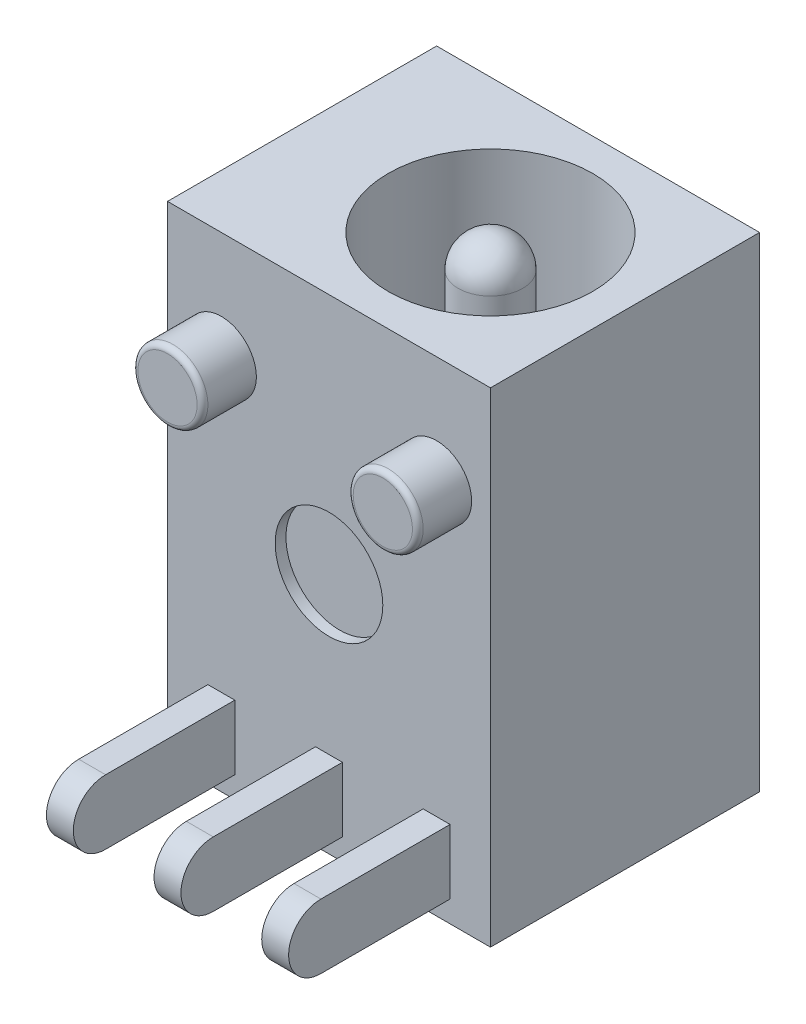
ISO-10303-21;
HEADER;
FILE_DESCRIPTION(('STEP AP214'),'2;1');
FILE_NAME('part.step','',(''),(''),'','','');
FILE_SCHEMA(('AUTOMOTIVE_DESIGN { 1 0 10303 214 1 1 1 1 }'));
ENDSEC;
DATA;
#1=APPLICATION_CONTEXT('core data for automotive mechanical design processes');
#2=APPLICATION_PROTOCOL_DEFINITION('international standard','automotive_design',2000,#1);
#3=PRODUCT_CONTEXT('',#1,'mechanical');
#4=PRODUCT('Part','Part','',(#3));
#5=PRODUCT_RELATED_PRODUCT_CATEGORY('part','',(#4));
#6=PRODUCT_DEFINITION_FORMATION('','',#4);
#7=PRODUCT_DEFINITION_CONTEXT('part definition',#1,'design');
#8=PRODUCT_DEFINITION('design','',#6,#7);
#9=PRODUCT_DEFINITION_SHAPE('','',#8);
#10=(LENGTH_UNIT() NAMED_UNIT(*) SI_UNIT(.MILLI.,.METRE.));
#11=(NAMED_UNIT(*) PLANE_ANGLE_UNIT() SI_UNIT($,.RADIAN.));
#12=(NAMED_UNIT(*) SI_UNIT($,.STERADIAN.) SOLID_ANGLE_UNIT());
#13=UNCERTAINTY_MEASURE_WITH_UNIT(LENGTH_MEASURE(1.E-05),#10,'distance_accuracy_value','');
#14=(GEOMETRIC_REPRESENTATION_CONTEXT(3) GLOBAL_UNCERTAINTY_ASSIGNED_CONTEXT((#13)) GLOBAL_UNIT_ASSIGNED_CONTEXT((#10,
#11,#12)) REPRESENTATION_CONTEXT('',''));
#15=CARTESIAN_POINT('',(0.,0.,0.));
#16=DIRECTION('',(0.,0.,1.));
#17=DIRECTION('',(1.,0.,0.));
#18=AXIS2_PLACEMENT_3D('',#15,#16,#17);
#19=CARTESIAN_POINT('',(0.5,8.4,0.));
#20=DIRECTION('',(0.,0.,-1.));
#21=DIRECTION('',(0.,1.,0.));
#22=AXIS2_PLACEMENT_3D('',#19,#20,#21);
#23=SPHERICAL_SURFACE('',#22,0.6);
#24=CARTESIAN_POINT('',(0.5,8.4,0.));
#25=DIRECTION('',(0.,1.,0.));
#26=DIRECTION('',(0.,0.,1.));
#27=AXIS2_PLACEMENT_3D('',#24,#25,#26);
#28=CIRCLE('',#27,0.6);
#29=CARTESIAN_POINT('',(0.5,8.4,0.6));
#30=VERTEX_POINT('',#29);
#31=CARTESIAN_POINT('',(0.5,8.4,-0.6));
#32=VERTEX_POINT('',#31);
#33=EDGE_CURVE('E272',#30,#32,#28,.F.);
#34=ORIENTED_EDGE('',*,*,#33,.F.);
#35=CARTESIAN_POINT('',(0.5,8.4,0.));
#36=DIRECTION('',(0.,1.,0.));
#37=DIRECTION('',(0.,0.,1.));
#38=AXIS2_PLACEMENT_3D('',#35,#36,#37);
#39=CIRCLE('',#38,0.6);
#40=EDGE_CURVE('E356',#32,#30,#39,.F.);
#41=ORIENTED_EDGE('',*,*,#40,.F.);
#42=EDGE_LOOP('',(#34,#41));
#43=FACE_BOUND('',#42,.T.);
#44=ADVANCED_FACE('F25',(#43),#23,.T.);
#45=CARTESIAN_POINT('',(-2.,7.,3.5));
#46=DIRECTION('',(0.,0.,1.));
#47=DIRECTION('',(1.,0.,0.));
#48=AXIS2_PLACEMENT_3D('',#45,#46,#47);
#49=PLANE('',#48);
#50=CARTESIAN_POINT('',(-2.,7.,3.5));
#51=DIRECTION('',(0.,0.,-1.));
#52=DIRECTION('',(-1.,0.,0.));
#53=AXIS2_PLACEMENT_3D('',#50,#51,#52);
#54=CIRCLE('',#53,0.55);
#55=CARTESIAN_POINT('',(-2.55,7.,3.5));
#56=VERTEX_POINT('',#55);
#57=CARTESIAN_POINT('',(-1.45,7.,3.5));
#58=VERTEX_POINT('',#57);
#59=EDGE_CURVE('E266',#56,#58,#54,.T.);
#60=ORIENTED_EDGE('',*,*,#59,.F.);
#61=CARTESIAN_POINT('',(-2.,7.,3.5));
#62=DIRECTION('',(0.,0.,-1.));
#63=DIRECTION('',(1.,0.,0.));
#64=AXIS2_PLACEMENT_3D('',#61,#62,#63);
#65=CIRCLE('',#64,0.55);
#66=EDGE_CURVE('E268',#58,#56,#65,.T.);
#67=ORIENTED_EDGE('',*,*,#66,.F.);
#68=EDGE_LOOP('',(#60,#67));
#69=FACE_BOUND('',#68,.T.);
#70=ADVANCED_FACE('F274',(#69),#49,.T.);
#71=CARTESIAN_POINT('',(2.,7.,3.5));
#72=DIRECTION('',(0.,0.,1.));
#73=DIRECTION('',(1.,0.,0.));
#74=AXIS2_PLACEMENT_3D('',#71,#72,#73);
#75=PLANE('',#74);
#76=CARTESIAN_POINT('',(2.,7.,3.5));
#77=DIRECTION('',(0.,0.,-1.));
#78=DIRECTION('',(-1.,0.,0.));
#79=AXIS2_PLACEMENT_3D('',#76,#77,#78);
#80=CIRCLE('',#79,0.55);
#81=CARTESIAN_POINT('',(1.45,7.,3.5));
#82=VERTEX_POINT('',#81);
#83=CARTESIAN_POINT('',(2.55,7.,3.5));
#84=VERTEX_POINT('',#83);
#85=EDGE_CURVE('E276',#82,#84,#80,.T.);
#86=ORIENTED_EDGE('',*,*,#85,.F.);
#87=CARTESIAN_POINT('',(2.,7.,3.5));
#88=DIRECTION('',(0.,0.,-1.));
#89=DIRECTION('',(1.,0.,0.));
#90=AXIS2_PLACEMENT_3D('',#87,#88,#89);
#91=CIRCLE('',#90,0.55);
#92=EDGE_CURVE('E228',#84,#82,#91,.T.);
#93=ORIENTED_EDGE('',*,*,#92,.F.);
#94=EDGE_LOOP('',(#86,#93));
#95=FACE_BOUND('',#94,.T.);
#96=ADVANCED_FACE('F292',(#95),#75,.T.);
#97=CARTESIAN_POINT('',(0.25,0.4,5.5));
#98=DIRECTION('',(-1.,0.,0.));
#99=DIRECTION('',(0.,0.,1.));
#100=AXIS2_PLACEMENT_3D('',#97,#98,#99);
#101=PLANE('',#100);
#102=CARTESIAN_POINT('',(0.25,1.,4.9));
#103=DIRECTION('',(1.,0.,0.));
#104=DIRECTION('',(0.,0.,-1.));
#105=AXIS2_PLACEMENT_3D('',#102,#103,#104);
#106=CIRCLE('',#105,0.6);
#107=CARTESIAN_POINT('',(0.25,0.4,4.9));
#108=VERTEX_POINT('',#107);
#109=CARTESIAN_POINT('',(0.25,1.6,4.9));
#110=VERTEX_POINT('',#109);
#111=EDGE_CURVE('E180',#108,#110,#106,.F.);
#112=ORIENTED_EDGE('',*,*,#111,.F.);
#113=DIRECTION('',(0.,0.,1.));
#114=VECTOR('',#113,1.);
#115=CARTESIAN_POINT('',(0.25,0.4,5.5));
#116=LINE('',#115,#114);
#117=CARTESIAN_POINT('',(0.25,0.4,2.5));
#118=VERTEX_POINT('',#117);
#119=EDGE_CURVE('E186',#108,#118,#116,.F.);
#120=ORIENTED_EDGE('',*,*,#119,.T.);
#121=DIRECTION('',(0.,1.,0.));
#122=VECTOR('',#121,1.);
#123=CARTESIAN_POINT('',(0.25,0.4,2.5));
#124=LINE('',#123,#122);
#125=CARTESIAN_POINT('',(0.25,1.6,2.5));
#126=VERTEX_POINT('',#125);
#127=EDGE_CURVE('E191',#126,#118,#124,.F.);
#128=ORIENTED_EDGE('',*,*,#127,.F.);
#129=DIRECTION('',(0.,0.,-1.));
#130=VECTOR('',#129,1.);
#131=CARTESIAN_POINT('',(0.25,1.6,5.5));
#132=LINE('',#131,#130);
#133=EDGE_CURVE('E188',#126,#110,#132,.F.);
#134=ORIENTED_EDGE('',*,*,#133,.T.);
#135=EDGE_LOOP('',(#112,#120,#128,#134));
#136=FACE_BOUND('',#135,.T.);
#137=ADVANCED_FACE('F185',(#136),#101,.F.);
#138=CARTESIAN_POINT('',(2.25,1.6,5.5));
#139=DIRECTION('',(-1.,0.,0.));
#140=DIRECTION('',(0.,-1.,0.));
#141=AXIS2_PLACEMENT_3D('',#138,#139,#140);
#142=PLANE('',#141);
#143=CARTESIAN_POINT('',(2.25,1.,4.9));
#144=DIRECTION('',(1.,0.,0.));
#145=DIRECTION('',(0.,0.,-1.));
#146=AXIS2_PLACEMENT_3D('',#143,#144,#145);
#147=CIRCLE('',#146,0.6);
#148=CARTESIAN_POINT('',(2.25,0.4,4.9));
#149=VERTEX_POINT('',#148);
#150=CARTESIAN_POINT('',(2.25,1.6,4.9));
#151=VERTEX_POINT('',#150);
#152=EDGE_CURVE('E459',#149,#151,#147,.F.);
#153=ORIENTED_EDGE('',*,*,#152,.F.);
#154=DIRECTION('',(0.,0.,1.));
#155=VECTOR('',#154,1.);
#156=CARTESIAN_POINT('',(2.25,0.4,5.5));
#157=LINE('',#156,#155);
#158=CARTESIAN_POINT('',(2.25,0.4,2.5));
#159=VERTEX_POINT('',#158);
#160=EDGE_CURVE('E366',#149,#159,#157,.F.);
#161=ORIENTED_EDGE('',*,*,#160,.T.);
#162=DIRECTION('',(0.,-1.,0.));
#163=VECTOR('',#162,1.);
#164=CARTESIAN_POINT('',(2.25,1.6,2.5));
#165=LINE('',#164,#163);
#166=CARTESIAN_POINT('',(2.25,1.6,2.5));
#167=VERTEX_POINT('',#166);
#168=EDGE_CURVE('E190',#167,#159,#165,.T.);
#169=ORIENTED_EDGE('',*,*,#168,.F.);
#170=DIRECTION('',(0.,0.,-1.));
#171=VECTOR('',#170,1.);
#172=CARTESIAN_POINT('',(2.25,1.6,5.5));
#173=LINE('',#172,#171);
#174=EDGE_CURVE('E210',#167,#151,#173,.F.);
#175=ORIENTED_EDGE('',*,*,#174,.T.);
#176=EDGE_LOOP('',(#153,#161,#169,#175));
#177=FACE_BOUND('',#176,.T.);
#178=ADVANCED_FACE('F669',(#177),#142,.F.);
#179=CARTESIAN_POINT('',(-1.75,0.4,5.5));
#180=DIRECTION('',(-1.,0.,0.));
#181=DIRECTION('',(0.,0.,1.));
#182=AXIS2_PLACEMENT_3D('',#179,#180,#181);
#183=PLANE('',#182);
#184=CARTESIAN_POINT('',(-1.75,1.,4.9));
#185=DIRECTION('',(-1.,0.,0.));
#186=DIRECTION('',(0.,0.,1.));
#187=AXIS2_PLACEMENT_3D('',#184,#185,#186);
#188=CIRCLE('',#187,0.6);
#189=CARTESIAN_POINT('',(-1.75,0.4,4.9));
#190=VERTEX_POINT('',#189);
#191=CARTESIAN_POINT('',(-1.75,1.6,4.9));
#192=VERTEX_POINT('',#191);
#193=EDGE_CURVE('E341',#190,#192,#188,.T.);
#194=ORIENTED_EDGE('',*,*,#193,.F.);
#195=DIRECTION('',(0.,0.,1.));
#196=VECTOR('',#195,1.);
#197=CARTESIAN_POINT('',(-1.75,0.4,5.5));
#198=LINE('',#197,#196);
#199=CARTESIAN_POINT('',(-1.75,0.4,2.5));
#200=VERTEX_POINT('',#199);
#201=EDGE_CURVE('E323',#190,#200,#198,.F.);
#202=ORIENTED_EDGE('',*,*,#201,.T.);
#203=DIRECTION('',(0.,1.,0.));
#204=VECTOR('',#203,1.);
#205=CARTESIAN_POINT('',(-1.75,0.4,2.5));
#206=LINE('',#205,#204);
#207=CARTESIAN_POINT('',(-1.75,1.6,2.5));
#208=VERTEX_POINT('',#207);
#209=EDGE_CURVE('E353',#208,#200,#206,.F.);
#210=ORIENTED_EDGE('',*,*,#209,.F.);
#211=DIRECTION('',(0.,0.,-1.));
#212=VECTOR('',#211,1.);
#213=CARTESIAN_POINT('',(-1.75,1.6,5.5));
#214=LINE('',#213,#212);
#215=EDGE_CURVE('E358',#208,#192,#214,.F.);
#216=ORIENTED_EDGE('',*,*,#215,.T.);
#217=EDGE_LOOP('',(#194,#202,#210,#216));
#218=FACE_BOUND('',#217,.T.);
#219=ADVANCED_FACE('F515',(#218),#183,.F.);
#220=CARTESIAN_POINT('',(0.5,2.,0.));
#221=DIRECTION('',(0.,1.,0.));
#222=DIRECTION('',(0.,0.,1.));
#223=AXIS2_PLACEMENT_3D('',#220,#221,#222);
#224=CYLINDRICAL_SURFACE('',#223,0.6);
#225=CARTESIAN_POINT('',(0.5,2.,0.));
#226=DIRECTION('',(0.,1.,0.));
#227=DIRECTION('',(0.,0.,1.));
#228=AXIS2_PLACEMENT_3D('',#225,#226,#227);
#229=CIRCLE('',#228,0.6);
#230=CARTESIAN_POINT('',(0.5,2.,0.6));
#231=VERTEX_POINT('',#230);
#232=EDGE_CURVE('E326',#231,#231,#229,.F.);
#233=ORIENTED_EDGE('',*,*,#232,.F.);
#234=EDGE_LOOP('',(#233));
#235=FACE_BOUND('',#234,.T.);
#236=ORIENTED_EDGE('',*,*,#40,.T.);
#237=ORIENTED_EDGE('',*,*,#33,.T.);
#238=EDGE_LOOP('',(#236,#237));
#239=FACE_BOUND('',#238,.T.);
#240=ADVANCED_FACE('F554',(#235,#239),#224,.T.);
#241=CARTESIAN_POINT('',(0.,4.5,2.3));
#242=DIRECTION('',(0.,0.,1.));
#243=DIRECTION('',(1.,0.,0.));
#244=AXIS2_PLACEMENT_3D('',#241,#242,#243);
#245=PLANE('',#244);
#246=CARTESIAN_POINT('',(0.,4.5,2.3));
#247=DIRECTION('',(0.,0.,1.));
#248=DIRECTION('',(1.,0.,0.));
#249=AXIS2_PLACEMENT_3D('',#246,#247,#248);
#250=CIRCLE('',#249,1.);
#251=CARTESIAN_POINT('',(1.,4.5,2.3));
#252=VERTEX_POINT('',#251);
#253=EDGE_CURVE('E337',#252,#252,#250,.T.);
#254=ORIENTED_EDGE('',*,*,#253,.T.);
#255=EDGE_LOOP('',(#254));
#256=FACE_BOUND('',#255,.T.);
#257=ADVANCED_FACE('F649',(#256),#245,.T.);
#258=CARTESIAN_POINT('',(-2.,7.,3.4));
#259=DIRECTION('',(0.,0.,1.));
#260=DIRECTION('',(1.,0.,0.));
#261=AXIS2_PLACEMENT_3D('',#258,#259,#260);
#262=TOROIDAL_SURFACE('',#261,0.55,0.1);
#263=CARTESIAN_POINT('',(-2.,7.,3.4));
#264=DIRECTION('',(0.,0.,-1.));
#265=DIRECTION('',(-1.,0.,0.));
#266=AXIS2_PLACEMENT_3D('',#263,#264,#265);
#267=CIRCLE('',#266,0.65);
#268=CARTESIAN_POINT('',(-2.65,7.,3.4));
#269=VERTEX_POINT('',#268);
#270=EDGE_CURVE('E235',#269,#269,#267,.T.);
#271=ORIENTED_EDGE('',*,*,#270,.F.);
#272=EDGE_LOOP('',(#271));
#273=FACE_BOUND('',#272,.T.);
#274=ORIENTED_EDGE('',*,*,#66,.T.);
#275=ORIENTED_EDGE('',*,*,#59,.T.);
#276=EDGE_LOOP('',(#274,#275));
#277=FACE_BOUND('',#276,.T.);
#278=ADVANCED_FACE('F244',(#273,#277),#262,.T.);
#279=CARTESIAN_POINT('',(2.,7.,3.4));
#280=DIRECTION('',(0.,0.,1.));
#281=DIRECTION('',(1.,0.,0.));
#282=AXIS2_PLACEMENT_3D('',#279,#280,#281);
#283=TOROIDAL_SURFACE('',#282,0.55,0.1);
#284=CARTESIAN_POINT('',(2.,7.,3.4));
#285=DIRECTION('',(0.,0.,-1.));
#286=DIRECTION('',(-1.,0.,0.));
#287=AXIS2_PLACEMENT_3D('',#284,#285,#286);
#288=CIRCLE('',#287,0.65);
#289=CARTESIAN_POINT('',(1.35,7.,3.4));
#290=VERTEX_POINT('',#289);
#291=EDGE_CURVE('E231',#290,#290,#288,.T.);
#292=ORIENTED_EDGE('',*,*,#291,.F.);
#293=EDGE_LOOP('',(#292));
#294=FACE_BOUND('',#293,.T.);
#295=ORIENTED_EDGE('',*,*,#92,.T.);
#296=ORIENTED_EDGE('',*,*,#85,.T.);
#297=EDGE_LOOP('',(#295,#296));
#298=FACE_BOUND('',#297,.T.);
#299=ADVANCED_FACE('F240',(#294,#298),#283,.T.);
#300=CARTESIAN_POINT('',(0.25,0.4,5.5));
#301=DIRECTION('',(0.,1.,0.));
#302=DIRECTION('',(0.,0.,1.));
#303=AXIS2_PLACEMENT_3D('',#300,#301,#302);
#304=PLANE('',#303);
#305=DIRECTION('',(-1.,0.,0.));
#306=VECTOR('',#305,1.);
#307=CARTESIAN_POINT('',(0.,0.4,4.9));
#308=LINE('',#307,#306);
#309=CARTESIAN_POINT('',(-0.25,0.4,4.9));
#310=VERTEX_POINT('',#309);
#311=EDGE_CURVE('E197',#310,#108,#308,.F.);
#312=ORIENTED_EDGE('',*,*,#311,.F.);
#313=DIRECTION('',(0.,0.,-1.));
#314=VECTOR('',#313,1.);
#315=CARTESIAN_POINT('',(-0.25,0.4,5.5));
#316=LINE('',#315,#314);
#317=CARTESIAN_POINT('',(-0.25,0.4,2.5));
#318=VERTEX_POINT('',#317);
#319=EDGE_CURVE('E234',#310,#318,#316,.T.);
#320=ORIENTED_EDGE('',*,*,#319,.T.);
#321=DIRECTION('',(1.,0.,0.));
#322=VECTOR('',#321,1.);
#323=CARTESIAN_POINT('',(0.25,0.4,2.5));
#324=LINE('',#323,#322);
#325=EDGE_CURVE('E199',#118,#318,#324,.F.);
#326=ORIENTED_EDGE('',*,*,#325,.F.);
#327=ORIENTED_EDGE('',*,*,#119,.F.);
#328=EDGE_LOOP('',(#312,#320,#326,#327));
#329=FACE_BOUND('',#328,.T.);
#330=ADVANCED_FACE('F195',(#329),#304,.F.);
#331=CARTESIAN_POINT('',(0.25,1.6,5.5));
#332=DIRECTION('',(0.,-1.,0.));
#333=DIRECTION('',(0.,0.,-1.));
#334=AXIS2_PLACEMENT_3D('',#331,#332,#333);
#335=PLANE('',#334);
#336=DIRECTION('',(1.,0.,0.));
#337=VECTOR('',#336,1.);
#338=CARTESIAN_POINT('',(0.,1.6,4.9));
#339=LINE('',#338,#337);
#340=CARTESIAN_POINT('',(-0.25,1.6,4.9));
#341=VERTEX_POINT('',#340);
#342=EDGE_CURVE('E206',#110,#341,#339,.F.);
#343=ORIENTED_EDGE('',*,*,#342,.F.);
#344=ORIENTED_EDGE('',*,*,#133,.F.);
#345=DIRECTION('',(1.,0.,0.));
#346=VECTOR('',#345,1.);
#347=CARTESIAN_POINT('',(0.25,1.6,2.5));
#348=LINE('',#347,#346);
#349=CARTESIAN_POINT('',(-0.25,1.6,2.5));
#350=VERTEX_POINT('',#349);
#351=EDGE_CURVE('E201',#350,#126,#348,.T.);
#352=ORIENTED_EDGE('',*,*,#351,.F.);
#353=DIRECTION('',(0.,0.,-1.));
#354=VECTOR('',#353,1.);
#355=CARTESIAN_POINT('',(-0.25,1.6,5.5));
#356=LINE('',#355,#354);
#357=EDGE_CURVE('E433',#350,#341,#356,.F.);
#358=ORIENTED_EDGE('',*,*,#357,.T.);
#359=EDGE_LOOP('',(#343,#344,#352,#358));
#360=FACE_BOUND('',#359,.T.);
#361=ADVANCED_FACE('F497',(#360),#335,.F.);
#362=CARTESIAN_POINT('',(0.,1.,4.9));
#363=DIRECTION('',(-1.,0.,0.));
#364=DIRECTION('',(0.,0.,1.));
#365=AXIS2_PLACEMENT_3D('',#362,#363,#364);
#366=CYLINDRICAL_SURFACE('',#365,0.6);
#367=ORIENTED_EDGE('',*,*,#311,.T.);
#368=ORIENTED_EDGE('',*,*,#111,.T.);
#369=ORIENTED_EDGE('',*,*,#342,.T.);
#370=CARTESIAN_POINT('',(-0.25,1.,4.9));
#371=DIRECTION('',(-1.,0.,0.));
#372=DIRECTION('',(0.,0.,1.));
#373=AXIS2_PLACEMENT_3D('',#370,#371,#372);
#374=CIRCLE('',#373,0.6);
#375=EDGE_CURVE('E204',#341,#310,#374,.F.);
#376=ORIENTED_EDGE('',*,*,#375,.T.);
#377=EDGE_LOOP('',(#367,#368,#369,#376));
#378=FACE_BOUND('',#377,.T.);
#379=ADVANCED_FACE('F203',(#378),#366,.T.);
#380=CARTESIAN_POINT('',(2.25,1.6,5.5));
#381=DIRECTION('',(0.,-1.,0.));
#382=DIRECTION('',(0.,0.,-1.));
#383=AXIS2_PLACEMENT_3D('',#380,#381,#382);
#384=PLANE('',#383);
#385=DIRECTION('',(-1.,0.,0.));
#386=VECTOR('',#385,1.);
#387=CARTESIAN_POINT('',(0.,1.6,4.9));
#388=LINE('',#387,#386);
#389=CARTESIAN_POINT('',(1.75,1.6,4.9));
#390=VERTEX_POINT('',#389);
#391=EDGE_CURVE('E467',#151,#390,#388,.T.);
#392=ORIENTED_EDGE('',*,*,#391,.F.);
#393=ORIENTED_EDGE('',*,*,#174,.F.);
#394=DIRECTION('',(1.,0.,0.));
#395=VECTOR('',#394,1.);
#396=CARTESIAN_POINT('',(2.25,1.6,2.5));
#397=LINE('',#396,#395);
#398=CARTESIAN_POINT('',(1.75,1.6,2.5));
#399=VERTEX_POINT('',#398);
#400=EDGE_CURVE('E205',#399,#167,#397,.T.);
#401=ORIENTED_EDGE('',*,*,#400,.F.);
#402=DIRECTION('',(0.,0.,-1.));
#403=VECTOR('',#402,1.);
#404=CARTESIAN_POINT('',(1.75,1.6,5.5));
#405=LINE('',#404,#403);
#406=EDGE_CURVE('E427',#399,#390,#405,.F.);
#407=ORIENTED_EDGE('',*,*,#406,.T.);
#408=EDGE_LOOP('',(#392,#393,#401,#407));
#409=FACE_BOUND('',#408,.T.);
#410=ADVANCED_FACE('F626',(#409),#384,.F.);
#411=CARTESIAN_POINT('',(0.,1.,4.9));
#412=DIRECTION('',(1.,0.,0.));
#413=DIRECTION('',(0.,0.,-1.));
#414=AXIS2_PLACEMENT_3D('',#411,#412,#413);
#415=CYLINDRICAL_SURFACE('',#414,0.6);
#416=ORIENTED_EDGE('',*,*,#152,.T.);
#417=ORIENTED_EDGE('',*,*,#391,.T.);
#418=CARTESIAN_POINT('',(1.75,1.,4.9));
#419=DIRECTION('',(1.,0.,0.));
#420=DIRECTION('',(0.,0.,-1.));
#421=AXIS2_PLACEMENT_3D('',#418,#419,#420);
#422=CIRCLE('',#421,0.6);
#423=CARTESIAN_POINT('',(1.75,0.4,4.9));
#424=VERTEX_POINT('',#423);
#425=EDGE_CURVE('E424',#390,#424,#422,.T.);
#426=ORIENTED_EDGE('',*,*,#425,.T.);
#427=DIRECTION('',(1.,0.,0.));
#428=VECTOR('',#427,1.);
#429=CARTESIAN_POINT('',(2.25,0.4,4.9));
#430=LINE('',#429,#428);
#431=EDGE_CURVE('E452',#424,#149,#430,.T.);
#432=ORIENTED_EDGE('',*,*,#431,.T.);
#433=EDGE_LOOP('',(#416,#417,#426,#432));
#434=FACE_BOUND('',#433,.T.);
#435=ADVANCED_FACE('F622',(#434),#415,.T.);
#436=CARTESIAN_POINT('',(2.25,0.4,5.5));
#437=DIRECTION('',(0.,1.,0.));
#438=DIRECTION('',(0.,0.,1.));
#439=AXIS2_PLACEMENT_3D('',#436,#437,#438);
#440=PLANE('',#439);
#441=ORIENTED_EDGE('',*,*,#431,.F.);
#442=DIRECTION('',(0.,0.,-1.));
#443=VECTOR('',#442,1.);
#444=CARTESIAN_POINT('',(1.75,0.4,5.5));
#445=LINE('',#444,#443);
#446=CARTESIAN_POINT('',(1.75,0.4,2.5));
#447=VERTEX_POINT('',#446);
#448=EDGE_CURVE('E376',#424,#447,#445,.T.);
#449=ORIENTED_EDGE('',*,*,#448,.T.);
#450=DIRECTION('',(1.,0.,0.));
#451=VECTOR('',#450,1.);
#452=CARTESIAN_POINT('',(2.25,0.4,2.5));
#453=LINE('',#452,#451);
#454=EDGE_CURVE('E456',#159,#447,#453,.F.);
#455=ORIENTED_EDGE('',*,*,#454,.F.);
#456=ORIENTED_EDGE('',*,*,#160,.F.);
#457=EDGE_LOOP('',(#441,#449,#455,#456));
#458=FACE_BOUND('',#457,.T.);
#459=ADVANCED_FACE('F619',(#458),#440,.F.);
#460=CARTESIAN_POINT('',(-1.75,1.6,5.5));
#461=DIRECTION('',(0.,-1.,0.));
#462=DIRECTION('',(0.,0.,-1.));
#463=AXIS2_PLACEMENT_3D('',#460,#461,#462);
#464=PLANE('',#463);
#465=DIRECTION('',(1.,0.,0.));
#466=VECTOR('',#465,1.);
#467=CARTESIAN_POINT('',(0.,1.6,4.9));
#468=LINE('',#467,#466);
#469=CARTESIAN_POINT('',(-2.25,1.6,4.9));
#470=VERTEX_POINT('',#469);
#471=EDGE_CURVE('E361',#192,#470,#468,.F.);
#472=ORIENTED_EDGE('',*,*,#471,.F.);
#473=ORIENTED_EDGE('',*,*,#215,.F.);
#474=DIRECTION('',(1.,0.,0.));
#475=VECTOR('',#474,1.);
#476=CARTESIAN_POINT('',(-1.75,1.6,2.5));
#477=LINE('',#476,#475);
#478=CARTESIAN_POINT('',(-2.25,1.6,2.5));
#479=VERTEX_POINT('',#478);
#480=EDGE_CURVE('E362',#479,#208,#477,.T.);
#481=ORIENTED_EDGE('',*,*,#480,.F.);
#482=DIRECTION('',(0.,0.,-1.));
#483=VECTOR('',#482,1.);
#484=CARTESIAN_POINT('',(-2.25,1.6,5.5));
#485=LINE('',#484,#483);
#486=EDGE_CURVE('E373',#479,#470,#485,.F.);
#487=ORIENTED_EDGE('',*,*,#486,.T.);
#488=EDGE_LOOP('',(#472,#473,#481,#487));
#489=FACE_BOUND('',#488,.T.);
#490=ADVANCED_FACE('F517',(#489),#464,.F.);
#491=CARTESIAN_POINT('',(0.,1.,4.9));
#492=DIRECTION('',(-1.,0.,0.));
#493=DIRECTION('',(0.,0.,1.));
#494=AXIS2_PLACEMENT_3D('',#491,#492,#493);
#495=CYLINDRICAL_SURFACE('',#494,0.6);
#496=ORIENTED_EDGE('',*,*,#193,.T.);
#497=ORIENTED_EDGE('',*,*,#471,.T.);
#498=CARTESIAN_POINT('',(-2.25,1.,4.9));
#499=DIRECTION('',(-1.,0.,0.));
#500=DIRECTION('',(0.,0.,1.));
#501=AXIS2_PLACEMENT_3D('',#498,#499,#500);
#502=CIRCLE('',#501,0.6);
#503=CARTESIAN_POINT('',(-2.25,0.4,4.9));
#504=VERTEX_POINT('',#503);
#505=EDGE_CURVE('E347',#470,#504,#502,.F.);
#506=ORIENTED_EDGE('',*,*,#505,.T.);
#507=DIRECTION('',(1.,0.,0.));
#508=VECTOR('',#507,1.);
#509=CARTESIAN_POINT('',(-1.75,0.4,4.9));
#510=LINE('',#509,#508);
#511=EDGE_CURVE('E327',#504,#190,#510,.T.);
#512=ORIENTED_EDGE('',*,*,#511,.T.);
#513=EDGE_LOOP('',(#496,#497,#506,#512));
#514=FACE_BOUND('',#513,.T.);
#515=ADVANCED_FACE('F509',(#514),#495,.T.);
#516=CARTESIAN_POINT('',(-1.75,0.4,5.5));
#517=DIRECTION('',(0.,1.,0.));
#518=DIRECTION('',(0.,0.,1.));
#519=AXIS2_PLACEMENT_3D('',#516,#517,#518);
#520=PLANE('',#519);
#521=ORIENTED_EDGE('',*,*,#511,.F.);
#522=DIRECTION('',(0.,0.,-1.));
#523=VECTOR('',#522,1.);
#524=CARTESIAN_POINT('',(-2.25,0.4,5.5));
#525=LINE('',#524,#523);
#526=CARTESIAN_POINT('',(-2.25,0.4,2.5));
#527=VERTEX_POINT('',#526);
#528=EDGE_CURVE('E343',#504,#527,#525,.T.);
#529=ORIENTED_EDGE('',*,*,#528,.T.);
#530=DIRECTION('',(1.,0.,0.));
#531=VECTOR('',#530,1.);
#532=CARTESIAN_POINT('',(-1.75,0.4,2.5));
#533=LINE('',#532,#531);
#534=EDGE_CURVE('E339',#200,#527,#533,.F.);
#535=ORIENTED_EDGE('',*,*,#534,.F.);
#536=ORIENTED_EDGE('',*,*,#201,.F.);
#537=EDGE_LOOP('',(#521,#529,#535,#536));
#538=FACE_BOUND('',#537,.T.);
#539=ADVANCED_FACE('F526',(#538),#520,.F.);
#540=CARTESIAN_POINT('',(0.5,2.,0.));
#541=DIRECTION('',(0.,1.,0.));
#542=DIRECTION('',(0.,0.,1.));
#543=AXIS2_PLACEMENT_3D('',#540,#541,#542);
#544=PLANE('',#543);
#545=CARTESIAN_POINT('',(0.5,2.,0.));
#546=DIRECTION('',(0.,1.,0.));
#547=DIRECTION('',(0.,0.,1.));
#548=AXIS2_PLACEMENT_3D('',#545,#546,#547);
#549=CIRCLE('',#548,1.9);
#550=CARTESIAN_POINT('',(0.5,2.,1.9));
#551=VERTEX_POINT('',#550);
#552=EDGE_CURVE('E346',#551,#551,#549,.T.);
#553=ORIENTED_EDGE('',*,*,#552,.T.);
#554=EDGE_LOOP('',(#553));
#555=FACE_BOUND('',#554,.T.);
#556=ORIENTED_EDGE('',*,*,#232,.T.);
#557=EDGE_LOOP('',(#556));
#558=FACE_BOUND('',#557,.T.);
#559=ADVANCED_FACE('F608',(#555,#558),#544,.T.);
#560=CARTESIAN_POINT('',(0.,4.5,2.3));
#561=DIRECTION('',(0.,0.,1.));
#562=DIRECTION('',(1.,0.,0.));
#563=AXIS2_PLACEMENT_3D('',#560,#561,#562);
#564=CYLINDRICAL_SURFACE('',#563,1.);
#565=ORIENTED_EDGE('',*,*,#253,.F.);
#566=EDGE_LOOP('',(#565));
#567=FACE_BOUND('',#566,.T.);
#568=CARTESIAN_POINT('',(0.,4.5,2.5));
#569=DIRECTION('',(0.,0.,1.));
#570=DIRECTION('',(1.,0.,0.));
#571=AXIS2_PLACEMENT_3D('',#568,#569,#570);
#572=CIRCLE('',#571,1.);
#573=CARTESIAN_POINT('',(1.,4.5,2.5));
#574=VERTEX_POINT('',#573);
#575=EDGE_CURVE('E351',#574,#574,#572,.T.);
#576=ORIENTED_EDGE('',*,*,#575,.T.);
#577=EDGE_LOOP('',(#576));
#578=FACE_BOUND('',#577,.T.);
#579=ADVANCED_FACE('F604',(#567,#578),#564,.F.);
#580=CARTESIAN_POINT('',(-2.,7.,3.5));
#581=DIRECTION('',(0.,0.,-1.));
#582=DIRECTION('',(-1.,0.,0.));
#583=AXIS2_PLACEMENT_3D('',#580,#581,#582);
#584=CYLINDRICAL_SURFACE('',#583,0.65);
#585=ORIENTED_EDGE('',*,*,#270,.T.);
#586=EDGE_LOOP('',(#585));
#587=FACE_BOUND('',#586,.T.);
#588=CARTESIAN_POINT('',(-2.,7.,2.5));
#589=DIRECTION('',(0.,0.,-1.));
#590=DIRECTION('',(-1.,0.,0.));
#591=AXIS2_PLACEMENT_3D('',#588,#589,#590);
#592=CIRCLE('',#591,0.65);
#593=CARTESIAN_POINT('',(-2.65,7.,2.5));
#594=VERTEX_POINT('',#593);
#595=EDGE_CURVE('E378',#594,#594,#592,.F.);
#596=ORIENTED_EDGE('',*,*,#595,.T.);
#597=EDGE_LOOP('',(#596));
#598=FACE_BOUND('',#597,.T.);
#599=ADVANCED_FACE('F600',(#587,#598),#584,.T.);
#600=CARTESIAN_POINT('',(2.,7.,3.5));
#601=DIRECTION('',(0.,0.,-1.));
#602=DIRECTION('',(-1.,0.,0.));
#603=AXIS2_PLACEMENT_3D('',#600,#601,#602);
#604=CYLINDRICAL_SURFACE('',#603,0.65);
#605=ORIENTED_EDGE('',*,*,#291,.T.);
#606=EDGE_LOOP('',(#605));
#607=FACE_BOUND('',#606,.T.);
#608=CARTESIAN_POINT('',(2.,7.,2.5));
#609=DIRECTION('',(0.,0.,-1.));
#610=DIRECTION('',(-1.,0.,0.));
#611=AXIS2_PLACEMENT_3D('',#608,#609,#610);
#612=CIRCLE('',#611,0.65);
#613=CARTESIAN_POINT('',(1.35,7.,2.5));
#614=VERTEX_POINT('',#613);
#615=EDGE_CURVE('E224',#614,#614,#612,.F.);
#616=ORIENTED_EDGE('',*,*,#615,.T.);
#617=EDGE_LOOP('',(#616));
#618=FACE_BOUND('',#617,.T.);
#619=ADVANCED_FACE('F597',(#607,#618),#604,.T.);
#620=CARTESIAN_POINT('',(-0.25,0.4,5.5));
#621=DIRECTION('',(1.,0.,0.));
#622=DIRECTION('',(0.,0.,-1.));
#623=AXIS2_PLACEMENT_3D('',#620,#621,#622);
#624=PLANE('',#623);
#625=ORIENTED_EDGE('',*,*,#375,.F.);
#626=ORIENTED_EDGE('',*,*,#357,.F.);
#627=DIRECTION('',(0.,1.,0.));
#628=VECTOR('',#627,1.);
#629=CARTESIAN_POINT('',(-0.25,9.,2.5));
#630=LINE('',#629,#628);
#631=EDGE_CURVE('E220',#350,#318,#630,.F.);
#632=ORIENTED_EDGE('',*,*,#631,.T.);
#633=ORIENTED_EDGE('',*,*,#319,.F.);
#634=EDGE_LOOP('',(#625,#626,#632,#633));
#635=FACE_BOUND('',#634,.T.);
#636=ADVANCED_FACE('F500',(#635),#624,.F.);
#637=CARTESIAN_POINT('',(1.75,1.6,5.5));
#638=DIRECTION('',(1.,0.,0.));
#639=DIRECTION('',(0.,0.,-1.));
#640=AXIS2_PLACEMENT_3D('',#637,#638,#639);
#641=PLANE('',#640);
#642=ORIENTED_EDGE('',*,*,#425,.F.);
#643=ORIENTED_EDGE('',*,*,#406,.F.);
#644=DIRECTION('',(0.,1.,0.));
#645=VECTOR('',#644,1.);
#646=CARTESIAN_POINT('',(1.75,9.,2.5));
#647=LINE('',#646,#645);
#648=EDGE_CURVE('E223',#399,#447,#647,.F.);
#649=ORIENTED_EDGE('',*,*,#648,.T.);
#650=ORIENTED_EDGE('',*,*,#448,.F.);
#651=EDGE_LOOP('',(#642,#643,#649,#650));
#652=FACE_BOUND('',#651,.T.);
#653=ADVANCED_FACE('F591',(#652),#641,.F.);
#654=CARTESIAN_POINT('',(-2.25,0.4,5.5));
#655=DIRECTION('',(1.,0.,0.));
#656=DIRECTION('',(0.,0.,-1.));
#657=AXIS2_PLACEMENT_3D('',#654,#655,#656);
#658=PLANE('',#657);
#659=ORIENTED_EDGE('',*,*,#505,.F.);
#660=ORIENTED_EDGE('',*,*,#486,.F.);
#661=DIRECTION('',(0.,1.,0.));
#662=VECTOR('',#661,1.);
#663=CARTESIAN_POINT('',(-2.25,9.,2.5));
#664=LINE('',#663,#662);
#665=EDGE_CURVE('E368',#479,#527,#664,.F.);
#666=ORIENTED_EDGE('',*,*,#665,.T.);
#667=ORIENTED_EDGE('',*,*,#528,.F.);
#668=EDGE_LOOP('',(#659,#660,#666,#667));
#669=FACE_BOUND('',#668,.T.);
#670=ADVANCED_FACE('F521',(#669),#658,.F.);
#671=CARTESIAN_POINT('',(0.5,2.,0.));
#672=DIRECTION('',(0.,1.,0.));
#673=DIRECTION('',(0.,0.,1.));
#674=AXIS2_PLACEMENT_3D('',#671,#672,#673);
#675=CYLINDRICAL_SURFACE('',#674,1.9);
#676=ORIENTED_EDGE('',*,*,#552,.F.);
#677=EDGE_LOOP('',(#676));
#678=FACE_BOUND('',#677,.T.);
#679=CARTESIAN_POINT('',(0.5,9.,0.));
#680=DIRECTION('',(0.,1.,0.));
#681=DIRECTION('',(0.,0.,1.));
#682=AXIS2_PLACEMENT_3D('',#679,#680,#681);
#683=CIRCLE('',#682,1.9);
#684=CARTESIAN_POINT('',(0.5,9.,1.9));
#685=VERTEX_POINT('',#684);
#686=EDGE_CURVE('E393',#685,#685,#683,.T.);
#687=ORIENTED_EDGE('',*,*,#686,.T.);
#688=EDGE_LOOP('',(#687));
#689=FACE_BOUND('',#688,.T.);
#690=ADVANCED_FACE('F585',(#678,#689),#675,.F.);
#691=CARTESIAN_POINT('',(-3.,9.,2.5));
#692=DIRECTION('',(0.,0.,-1.));
#693=DIRECTION('',(-1.,0.,0.));
#694=AXIS2_PLACEMENT_3D('',#691,#692,#693);
#695=PLANE('',#694);
#696=ORIENTED_EDGE('',*,*,#480,.T.);
#697=ORIENTED_EDGE('',*,*,#209,.T.);
#698=ORIENTED_EDGE('',*,*,#534,.T.);
#699=ORIENTED_EDGE('',*,*,#665,.F.);
#700=EDGE_LOOP('',(#696,#697,#698,#699));
#701=FACE_BOUND('',#700,.T.);
#702=ORIENTED_EDGE('',*,*,#400,.T.);
#703=ORIENTED_EDGE('',*,*,#168,.T.);
#704=ORIENTED_EDGE('',*,*,#454,.T.);
#705=ORIENTED_EDGE('',*,*,#648,.F.);
#706=EDGE_LOOP('',(#702,#703,#704,#705));
#707=FACE_BOUND('',#706,.T.);
#708=DIRECTION('',(0.,1.,0.));
#709=VECTOR('',#708,1.);
#710=CARTESIAN_POINT('',(3.,9.,2.5));
#711=LINE('',#710,#709);
#712=CARTESIAN_POINT('',(3.,0.,2.5));
#713=VERTEX_POINT('',#712);
#714=CARTESIAN_POINT('',(3.,9.,2.5));
#715=VERTEX_POINT('',#714);
#716=EDGE_CURVE('E371',#713,#715,#711,.T.);
#717=ORIENTED_EDGE('',*,*,#716,.T.);
#718=DIRECTION('',(1.,0.,0.));
#719=VECTOR('',#718,1.);
#720=CARTESIAN_POINT('',(0.,9.,2.5));
#721=LINE('',#720,#719);
#722=CARTESIAN_POINT('',(-3.,9.,2.5));
#723=VERTEX_POINT('',#722);
#724=EDGE_CURVE('E396',#715,#723,#721,.F.);
#725=ORIENTED_EDGE('',*,*,#724,.T.);
#726=DIRECTION('',(0.,1.,0.));
#727=VECTOR('',#726,1.);
#728=CARTESIAN_POINT('',(-3.,9.,2.5));
#729=LINE('',#728,#727);
#730=CARTESIAN_POINT('',(-3.,0.,2.5));
#731=VERTEX_POINT('',#730);
#732=EDGE_CURVE('E332',#723,#731,#729,.F.);
#733=ORIENTED_EDGE('',*,*,#732,.T.);
#734=DIRECTION('',(1.,0.,0.));
#735=VECTOR('',#734,1.);
#736=CARTESIAN_POINT('',(0.,0.,2.5));
#737=LINE('',#736,#735);
#738=EDGE_CURVE('E390',#713,#731,#737,.F.);
#739=ORIENTED_EDGE('',*,*,#738,.F.);
#740=EDGE_LOOP('',(#717,#725,#733,#739));
#741=FACE_BOUND('',#740,.T.);
#742=ORIENTED_EDGE('',*,*,#351,.T.);
#743=ORIENTED_EDGE('',*,*,#127,.T.);
#744=ORIENTED_EDGE('',*,*,#325,.T.);
#745=ORIENTED_EDGE('',*,*,#631,.F.);
#746=EDGE_LOOP('',(#742,#743,#744,#745));
#747=FACE_BOUND('',#746,.T.);
#748=ORIENTED_EDGE('',*,*,#615,.F.);
#749=EDGE_LOOP('',(#748));
#750=FACE_BOUND('',#749,.T.);
#751=ORIENTED_EDGE('',*,*,#595,.F.);
#752=EDGE_LOOP('',(#751));
#753=FACE_BOUND('',#752,.T.);
#754=ORIENTED_EDGE('',*,*,#575,.F.);
#755=EDGE_LOOP('',(#754));
#756=FACE_BOUND('',#755,.T.);
#757=ADVANCED_FACE('F493',(#701,#707,#741,#747,#750,#753,#756),#695,.F.);
#758=CARTESIAN_POINT('',(3.,9.,2.5));
#759=DIRECTION('',(-1.,0.,0.));
#760=DIRECTION('',(0.,0.,1.));
#761=AXIS2_PLACEMENT_3D('',#758,#759,#760);
#762=PLANE('',#761);
#763=DIRECTION('',(0.,1.,0.));
#764=VECTOR('',#763,1.);
#765=CARTESIAN_POINT('',(3.,9.,-2.5));
#766=LINE('',#765,#764);
#767=CARTESIAN_POINT('',(3.,0.,-2.5));
#768=VERTEX_POINT('',#767);
#769=CARTESIAN_POINT('',(3.,9.,-2.5));
#770=VERTEX_POINT('',#769);
#771=EDGE_CURVE('E400',#768,#770,#766,.T.);
#772=ORIENTED_EDGE('',*,*,#771,.T.);
#773=DIRECTION('',(0.,0.,-1.));
#774=VECTOR('',#773,1.);
#775=CARTESIAN_POINT('',(3.,9.,0.));
#776=LINE('',#775,#774);
#777=EDGE_CURVE('E333',#770,#715,#776,.F.);
#778=ORIENTED_EDGE('',*,*,#777,.T.);
#779=ORIENTED_EDGE('',*,*,#716,.F.);
#780=DIRECTION('',(0.,0.,-1.));
#781=VECTOR('',#780,1.);
#782=CARTESIAN_POINT('',(3.,0.,0.));
#783=LINE('',#782,#781);
#784=EDGE_CURVE('E388',#768,#713,#783,.F.);
#785=ORIENTED_EDGE('',*,*,#784,.F.);
#786=EDGE_LOOP('',(#772,#778,#779,#785));
#787=FACE_BOUND('',#786,.T.);
#788=ADVANCED_FACE('F578',(#787),#762,.F.);
#789=CARTESIAN_POINT('',(0.,9.,0.));
#790=DIRECTION('',(0.,-1.,0.));
#791=DIRECTION('',(0.,0.,-1.));
#792=AXIS2_PLACEMENT_3D('',#789,#790,#791);
#793=PLANE('',#792);
#794=DIRECTION('',(1.,0.,0.));
#795=VECTOR('',#794,1.);
#796=CARTESIAN_POINT('',(-3.,9.,-2.5));
#797=LINE('',#796,#795);
#798=CARTESIAN_POINT('',(-3.,9.,-2.5));
#799=VERTEX_POINT('',#798);
#800=EDGE_CURVE('E384',#770,#799,#797,.F.);
#801=ORIENTED_EDGE('',*,*,#800,.T.);
#802=DIRECTION('',(0.,0.,-1.));
#803=VECTOR('',#802,1.);
#804=CARTESIAN_POINT('',(-3.,9.,2.5));
#805=LINE('',#804,#803);
#806=EDGE_CURVE('E329',#799,#723,#805,.F.);
#807=ORIENTED_EDGE('',*,*,#806,.T.);
#808=ORIENTED_EDGE('',*,*,#724,.F.);
#809=ORIENTED_EDGE('',*,*,#777,.F.);
#810=EDGE_LOOP('',(#801,#807,#808,#809));
#811=FACE_BOUND('',#810,.T.);
#812=ORIENTED_EDGE('',*,*,#686,.F.);
#813=EDGE_LOOP('',(#812));
#814=FACE_BOUND('',#813,.T.);
#815=ADVANCED_FACE('F574',(#811,#814),#793,.F.);
#816=CARTESIAN_POINT('',(-3.,9.,2.5));
#817=DIRECTION('',(1.,0.,0.));
#818=DIRECTION('',(0.,0.,-1.));
#819=AXIS2_PLACEMENT_3D('',#816,#817,#818);
#820=PLANE('',#819);
#821=ORIENTED_EDGE('',*,*,#732,.F.);
#822=ORIENTED_EDGE('',*,*,#806,.F.);
#823=DIRECTION('',(0.,1.,0.));
#824=VECTOR('',#823,1.);
#825=CARTESIAN_POINT('',(-3.,9.,-2.5));
#826=LINE('',#825,#824);
#827=CARTESIAN_POINT('',(-3.,0.,-2.5));
#828=VERTEX_POINT('',#827);
#829=EDGE_CURVE('E38',#799,#828,#826,.F.);
#830=ORIENTED_EDGE('',*,*,#829,.T.);
#831=DIRECTION('',(0.,0.,-1.));
#832=VECTOR('',#831,1.);
#833=CARTESIAN_POINT('',(-3.,0.,0.));
#834=LINE('',#833,#832);
#835=EDGE_CURVE('E50',#731,#828,#834,.T.);
#836=ORIENTED_EDGE('',*,*,#835,.F.);
#837=EDGE_LOOP('',(#821,#822,#830,#836));
#838=FACE_BOUND('',#837,.T.);
#839=ADVANCED_FACE('F568',(#838),#820,.F.);
#840=CARTESIAN_POINT('',(0.,0.,0.));
#841=DIRECTION('',(0.,-1.,0.));
#842=DIRECTION('',(0.,0.,-1.));
#843=AXIS2_PLACEMENT_3D('',#840,#841,#842);
#844=PLANE('',#843);
#845=ORIENTED_EDGE('',*,*,#835,.T.);
#846=DIRECTION('',(1.,0.,0.));
#847=VECTOR('',#846,1.);
#848=CARTESIAN_POINT('',(-3.,0.,-2.5));
#849=LINE('',#848,#847);
#850=EDGE_CURVE('E13',#828,#768,#849,.T.);
#851=ORIENTED_EDGE('',*,*,#850,.T.);
#852=ORIENTED_EDGE('',*,*,#784,.T.);
#853=ORIENTED_EDGE('',*,*,#738,.T.);
#854=EDGE_LOOP('',(#845,#851,#852,#853));
#855=FACE_BOUND('',#854,.T.);
#856=ADVANCED_FACE('F562',(#855),#844,.T.);
#857=CARTESIAN_POINT('',(-3.,9.,-2.5));
#858=DIRECTION('',(0.,0.,1.));
#859=DIRECTION('',(1.,0.,0.));
#860=AXIS2_PLACEMENT_3D('',#857,#858,#859);
#861=PLANE('',#860);
#862=ORIENTED_EDGE('',*,*,#829,.F.);
#863=ORIENTED_EDGE('',*,*,#800,.F.);
#864=ORIENTED_EDGE('',*,*,#771,.F.);
#865=ORIENTED_EDGE('',*,*,#850,.F.);
#866=EDGE_LOOP('',(#862,#863,#864,#865));
#867=FACE_BOUND('',#866,.T.);
#868=ADVANCED_FACE('F560',(#867),#861,.F.);
#869=CLOSED_SHELL('',(#44,#70,#96,#137,#178,#219,#240,#257,#278,#299,#330,#361,#379,#410,#435,
#459,#490,#515,#539,#559,#579,#599,#619,#636,#653,#670,#690,#757,#788,#815,#839,#856,#868));
#870=MANIFOLD_SOLID_BREP('B1',#869);
#871=ADVANCED_BREP_SHAPE_REPRESENTATION('',(#18,#870),#14);
#872=SHAPE_DEFINITION_REPRESENTATION(#9,#871);
ENDSEC;
END-ISO-10303-21;
